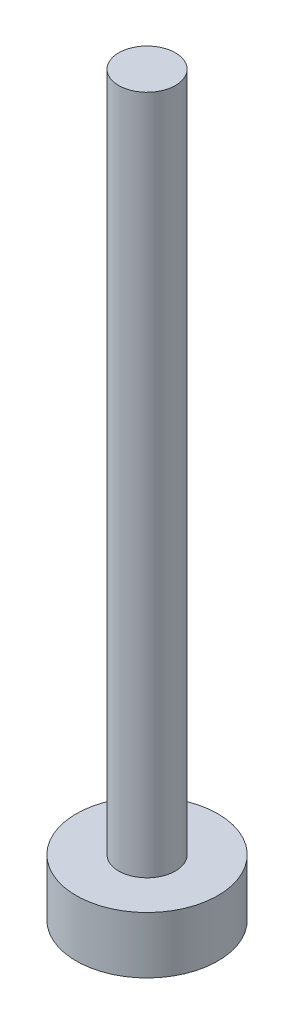
ISO-10303-21;
HEADER;
FILE_DESCRIPTION(('STEP AP214'),'2;1');
FILE_NAME('part.step','',(''),(''),'','','');
FILE_SCHEMA(('AUTOMOTIVE_DESIGN { 1 0 10303 214 1 1 1 1 }'));
ENDSEC;
DATA;
#1=APPLICATION_CONTEXT('core data for automotive mechanical design processes');
#2=APPLICATION_PROTOCOL_DEFINITION('international standard','automotive_design',2000,#1);
#3=PRODUCT_CONTEXT('',#1,'mechanical');
#4=PRODUCT('Part','Part','',(#3));
#5=PRODUCT_RELATED_PRODUCT_CATEGORY('part','',(#4));
#6=PRODUCT_DEFINITION_FORMATION('','',#4);
#7=PRODUCT_DEFINITION_CONTEXT('part definition',#1,'design');
#8=PRODUCT_DEFINITION('design','',#6,#7);
#9=PRODUCT_DEFINITION_SHAPE('','',#8);
#10=(LENGTH_UNIT() NAMED_UNIT(*) SI_UNIT(.MILLI.,.METRE.));
#11=(NAMED_UNIT(*) PLANE_ANGLE_UNIT() SI_UNIT($,.RADIAN.));
#12=(NAMED_UNIT(*) SI_UNIT($,.STERADIAN.) SOLID_ANGLE_UNIT());
#13=UNCERTAINTY_MEASURE_WITH_UNIT(LENGTH_MEASURE(1.E-05),#10,'distance_accuracy_value','');
#14=(GEOMETRIC_REPRESENTATION_CONTEXT(3) GLOBAL_UNCERTAINTY_ASSIGNED_CONTEXT((#13)) GLOBAL_UNIT_ASSIGNED_CONTEXT((#10,
#11,#12)) REPRESENTATION_CONTEXT('',''));
#15=CARTESIAN_POINT('',(0.,0.,0.));
#16=DIRECTION('',(0.,0.,1.));
#17=DIRECTION('',(1.,0.,0.));
#18=AXIS2_PLACEMENT_3D('',#15,#16,#17);
#19=CARTESIAN_POINT('',(0.,24.,0.));
#20=DIRECTION('',(0.,-1.,0.));
#21=DIRECTION('',(0.,0.,-1.));
#22=AXIS2_PLACEMENT_3D('',#19,#20,#21);
#23=CYLINDRICAL_SURFACE('',#22,1.);
#24=CARTESIAN_POINT('',(0.,24.,0.));
#25=DIRECTION('',(0.,1.,0.));
#26=DIRECTION('',(0.,0.,1.));
#27=AXIS2_PLACEMENT_3D('',#24,#25,#26);
#28=CIRCLE('',#27,1.);
#29=CARTESIAN_POINT('',(0.,24.,1.));
#30=VERTEX_POINT('',#29);
#31=EDGE_CURVE('E238',#30,#30,#28,.T.);
#32=ORIENTED_EDGE('',*,*,#31,.F.);
#33=EDGE_LOOP('',(#32));
#34=FACE_BOUND('',#33,.T.);
#35=CARTESIAN_POINT('',(0.,0.,0.));
#36=DIRECTION('',(0.,1.,0.));
#37=DIRECTION('',(0.,0.,1.));
#38=AXIS2_PLACEMENT_3D('',#35,#36,#37);
#39=CIRCLE('',#38,1.);
#40=CARTESIAN_POINT('',(0.,0.,1.));
#41=VERTEX_POINT('',#40);
#42=EDGE_CURVE('E235',#41,#41,#39,.T.);
#43=ORIENTED_EDGE('',*,*,#42,.T.);
#44=EDGE_LOOP('',(#43));
#45=FACE_BOUND('',#44,.T.);
#46=ADVANCED_FACE('F37',(#34,#45),#23,.T.);
#47=CARTESIAN_POINT('',(0.,24.,0.));
#48=DIRECTION('',(0.,1.,0.));
#49=DIRECTION('',(0.,0.,1.));
#50=AXIS2_PLACEMENT_3D('',#47,#48,#49);
#51=PLANE('',#50);
#52=ORIENTED_EDGE('',*,*,#31,.T.);
#53=EDGE_LOOP('',(#52));
#54=FACE_BOUND('',#53,.T.);
#55=ADVANCED_FACE('F422',(#54),#51,.T.);
#56=CARTESIAN_POINT('',(0.,-2.,0.));
#57=DIRECTION('',(0.,1.,0.));
#58=DIRECTION('',(0.,0.,1.));
#59=AXIS2_PLACEMENT_3D('',#56,#57,#58);
#60=CYLINDRICAL_SURFACE('',#59,2.5);
#61=CARTESIAN_POINT('',(0.,-2.,0.));
#62=DIRECTION('',(0.,-1.,0.));
#63=DIRECTION('',(0.,0.,-1.));
#64=AXIS2_PLACEMENT_3D('',#61,#62,#63);
#65=CIRCLE('',#64,2.5);
#66=CARTESIAN_POINT('',(0.,-2.,-2.5));
#67=VERTEX_POINT('',#66);
#68=EDGE_CURVE('E232',#67,#67,#65,.T.);
#69=ORIENTED_EDGE('',*,*,#68,.F.);
#70=EDGE_LOOP('',(#69));
#71=FACE_BOUND('',#70,.T.);
#72=CARTESIAN_POINT('',(0.,0.,0.));
#73=DIRECTION('',(0.,-1.,0.));
#74=DIRECTION('',(0.,0.,-1.));
#75=AXIS2_PLACEMENT_3D('',#72,#73,#74);
#76=CIRCLE('',#75,2.5);
#77=CARTESIAN_POINT('',(0.,0.,-2.5));
#78=VERTEX_POINT('',#77);
#79=EDGE_CURVE('E213',#78,#78,#76,.T.);
#80=ORIENTED_EDGE('',*,*,#79,.T.);
#81=EDGE_LOOP('',(#80));
#82=FACE_BOUND('',#81,.T.);
#83=ADVANCED_FACE('F428',(#71,#82),#60,.T.);
#84=CARTESIAN_POINT('',(0.,-2.,0.));
#85=DIRECTION('',(0.,-1.,0.));
#86=DIRECTION('',(0.,0.,-1.));
#87=AXIS2_PLACEMENT_3D('',#84,#85,#86);
#88=PLANE('',#87);
#89=DIRECTION('',(1.,0.,0.));
#90=VECTOR('',#89,1.);
#91=CARTESIAN_POINT('',(0.,-2.,-0.499999999999999));
#92=LINE('',#91,#90);
#93=CARTESIAN_POINT('',(0.5,-2.,-0.499999999999999));
#94=VERTEX_POINT('',#93);
#95=CARTESIAN_POINT('',(2.15,-2.,-0.499999999999999));
#96=VERTEX_POINT('',#95);
#97=EDGE_CURVE('E177',#94,#96,#92,.T.);
#98=ORIENTED_EDGE('',*,*,#97,.F.);
#99=DIRECTION('',(0.,0.,1.));
#100=VECTOR('',#99,1.);
#101=CARTESIAN_POINT('',(0.5,-2.,0.));
#102=LINE('',#101,#100);
#103=CARTESIAN_POINT('',(0.5,-2.,-2.15));
#104=VERTEX_POINT('',#103);
#105=EDGE_CURVE('E208',#104,#94,#102,.T.);
#106=ORIENTED_EDGE('',*,*,#105,.F.);
#107=DIRECTION('',(1.,0.,0.));
#108=VECTOR('',#107,1.);
#109=CARTESIAN_POINT('',(0.,-2.,-2.15));
#110=LINE('',#109,#108);
#111=CARTESIAN_POINT('',(-0.5,-2.,-2.15));
#112=VERTEX_POINT('',#111);
#113=EDGE_CURVE('E205',#112,#104,#110,.T.);
#114=ORIENTED_EDGE('',*,*,#113,.F.);
#115=DIRECTION('',(0.,0.,1.));
#116=VECTOR('',#115,1.);
#117=CARTESIAN_POINT('',(-0.5,-2.,0.));
#118=LINE('',#117,#116);
#119=CARTESIAN_POINT('',(-0.5,-2.,-0.499999999999999));
#120=VERTEX_POINT('',#119);
#121=EDGE_CURVE('E202',#112,#120,#118,.T.);
#122=ORIENTED_EDGE('',*,*,#121,.T.);
#123=DIRECTION('',(1.,0.,0.));
#124=VECTOR('',#123,1.);
#125=CARTESIAN_POINT('',(0.,-2.,-0.499999999999999));
#126=LINE('',#125,#124);
#127=CARTESIAN_POINT('',(-2.15,-2.,-0.499999999999999));
#128=VERTEX_POINT('',#127);
#129=EDGE_CURVE('E199',#128,#120,#126,.T.);
#130=ORIENTED_EDGE('',*,*,#129,.F.);
#131=DIRECTION('',(0.,0.,1.));
#132=VECTOR('',#131,1.);
#133=CARTESIAN_POINT('',(-2.15,-2.,0.));
#134=LINE('',#133,#132);
#135=CARTESIAN_POINT('',(-2.15,-2.,0.500000000000001));
#136=VERTEX_POINT('',#135);
#137=EDGE_CURVE('E196',#128,#136,#134,.T.);
#138=ORIENTED_EDGE('',*,*,#137,.T.);
#139=DIRECTION('',(1.,0.,0.));
#140=VECTOR('',#139,1.);
#141=CARTESIAN_POINT('',(0.,-2.,0.500000000000001));
#142=LINE('',#141,#140);
#143=CARTESIAN_POINT('',(-0.5,-2.,0.500000000000001));
#144=VERTEX_POINT('',#143);
#145=EDGE_CURVE('E193',#136,#144,#142,.T.);
#146=ORIENTED_EDGE('',*,*,#145,.T.);
#147=DIRECTION('',(0.,0.,1.));
#148=VECTOR('',#147,1.);
#149=CARTESIAN_POINT('',(-0.5,-2.,0.));
#150=LINE('',#149,#148);
#151=CARTESIAN_POINT('',(-0.5,-2.,2.15));
#152=VERTEX_POINT('',#151);
#153=EDGE_CURVE('E190',#144,#152,#150,.T.);
#154=ORIENTED_EDGE('',*,*,#153,.T.);
#155=DIRECTION('',(1.,0.,0.));
#156=VECTOR('',#155,1.);
#157=CARTESIAN_POINT('',(0.,-2.,2.15));
#158=LINE('',#157,#156);
#159=CARTESIAN_POINT('',(0.5,-2.,2.15));
#160=VERTEX_POINT('',#159);
#161=EDGE_CURVE('E185',#152,#160,#158,.T.);
#162=ORIENTED_EDGE('',*,*,#161,.T.);
#163=DIRECTION('',(0.,0.,1.));
#164=VECTOR('',#163,1.);
#165=CARTESIAN_POINT('',(0.5,-2.,0.));
#166=LINE('',#165,#164);
#167=CARTESIAN_POINT('',(0.5,-2.,0.500000000000001));
#168=VERTEX_POINT('',#167);
#169=EDGE_CURVE('E183',#168,#160,#166,.T.);
#170=ORIENTED_EDGE('',*,*,#169,.F.);
#171=DIRECTION('',(1.,0.,0.));
#172=VECTOR('',#171,1.);
#173=CARTESIAN_POINT('',(0.,-2.,0.500000000000001));
#174=LINE('',#173,#172);
#175=CARTESIAN_POINT('',(2.15,-2.,0.500000000000001));
#176=VERTEX_POINT('',#175);
#177=EDGE_CURVE('E165',#168,#176,#174,.T.);
#178=ORIENTED_EDGE('',*,*,#177,.T.);
#179=DIRECTION('',(0.,0.,1.));
#180=VECTOR('',#179,1.);
#181=CARTESIAN_POINT('',(2.15,-2.,0.));
#182=LINE('',#181,#180);
#183=EDGE_CURVE('E172',#96,#176,#182,.T.);
#184=ORIENTED_EDGE('',*,*,#183,.F.);
#185=EDGE_LOOP('',(#98,#106,#114,#122,#130,#138,#146,#154,#162,#170,#178,#184));
#186=FACE_BOUND('',#185,.T.);
#187=ORIENTED_EDGE('',*,*,#68,.T.);
#188=EDGE_LOOP('',(#187));
#189=FACE_BOUND('',#188,.T.);
#190=ADVANCED_FACE('F179',(#186,#189),#88,.T.);
#191=CARTESIAN_POINT('',(0.,0.,0.));
#192=DIRECTION('',(0.,-1.,0.));
#193=DIRECTION('',(0.,0.,-1.));
#194=AXIS2_PLACEMENT_3D('',#191,#192,#193);
#195=PLANE('',#194);
#196=ORIENTED_EDGE('',*,*,#42,.F.);
#197=EDGE_LOOP('',(#196));
#198=FACE_BOUND('',#197,.T.);
#199=ORIENTED_EDGE('',*,*,#79,.F.);
#200=EDGE_LOOP('',(#199));
#201=FACE_BOUND('',#200,.T.);
#202=ADVANCED_FACE('F661',(#198,#201),#195,.F.);
#203=CARTESIAN_POINT('',(0.,-1.5,-0.499999999999999));
#204=DIRECTION('',(0.,0.,-1.));
#205=DIRECTION('',(-1.,0.,0.));
#206=AXIS2_PLACEMENT_3D('',#203,#204,#205);
#207=PLANE('',#206);
#208=DIRECTION('',(0.,-1.,0.));
#209=VECTOR('',#208,1.);
#210=CARTESIAN_POINT('',(2.15,-1.5,-0.499999999999999));
#211=LINE('',#210,#209);
#212=CARTESIAN_POINT('',(2.15,-1.7,-0.499999999999999));
#213=VERTEX_POINT('',#212);
#214=EDGE_CURVE('E169',#213,#96,#211,.T.);
#215=ORIENTED_EDGE('',*,*,#214,.F.);
#216=DIRECTION('',(1.,0.,0.));
#217=VECTOR('',#216,1.);
#218=CARTESIAN_POINT('',(0.,-1.7,-0.499999999999999));
#219=LINE('',#218,#217);
#220=CARTESIAN_POINT('',(0.5,-1.7,-0.499999999999999));
#221=VERTEX_POINT('',#220);
#222=EDGE_CURVE('E11',#213,#221,#219,.F.);
#223=ORIENTED_EDGE('',*,*,#222,.T.);
#224=DIRECTION('',(0.,-1.,0.));
#225=VECTOR('',#224,1.);
#226=CARTESIAN_POINT('',(0.5,-1.5,-0.499999999999999));
#227=LINE('',#226,#225);
#228=EDGE_CURVE('E211',#221,#94,#227,.T.);
#229=ORIENTED_EDGE('',*,*,#228,.T.);
#230=ORIENTED_EDGE('',*,*,#97,.T.);
#231=EDGE_LOOP('',(#215,#223,#229,#230));
#232=FACE_BOUND('',#231,.T.);
#233=ADVANCED_FACE('F328',(#232),#207,.F.);
#234=CARTESIAN_POINT('',(0.5,-1.5,0.));
#235=DIRECTION('',(1.,0.,0.));
#236=DIRECTION('',(0.,0.,-1.));
#237=AXIS2_PLACEMENT_3D('',#234,#235,#236);
#238=PLANE('',#237);
#239=ORIENTED_EDGE('',*,*,#228,.F.);
#240=DIRECTION('',(0.,0.,1.));
#241=VECTOR('',#240,1.);
#242=CARTESIAN_POINT('',(0.5,-1.7,0.));
#243=LINE('',#242,#241);
#244=CARTESIAN_POINT('',(0.5,-1.7,-2.15));
#245=VERTEX_POINT('',#244);
#246=EDGE_CURVE('E268',#221,#245,#243,.F.);
#247=ORIENTED_EDGE('',*,*,#246,.T.);
#248=DIRECTION('',(0.,-1.,0.));
#249=VECTOR('',#248,1.);
#250=CARTESIAN_POINT('',(0.5,-1.5,-2.15));
#251=LINE('',#250,#249);
#252=EDGE_CURVE('E214',#245,#104,#251,.T.);
#253=ORIENTED_EDGE('',*,*,#252,.T.);
#254=ORIENTED_EDGE('',*,*,#105,.T.);
#255=EDGE_LOOP('',(#239,#247,#253,#254));
#256=FACE_BOUND('',#255,.T.);
#257=ADVANCED_FACE('F334',(#256),#238,.F.);
#258=CARTESIAN_POINT('',(0.,-1.5,-2.15));
#259=DIRECTION('',(0.,0.,-1.));
#260=DIRECTION('',(-1.,0.,0.));
#261=AXIS2_PLACEMENT_3D('',#258,#259,#260);
#262=PLANE('',#261);
#263=ORIENTED_EDGE('',*,*,#252,.F.);
#264=DIRECTION('',(1.,0.,0.));
#265=VECTOR('',#264,1.);
#266=CARTESIAN_POINT('',(0.,-1.7,-2.15));
#267=LINE('',#266,#265);
#268=CARTESIAN_POINT('',(-0.5,-1.7,-2.15));
#269=VERTEX_POINT('',#268);
#270=EDGE_CURVE('E271',#245,#269,#267,.F.);
#271=ORIENTED_EDGE('',*,*,#270,.T.);
#272=DIRECTION('',(0.,-1.,0.));
#273=VECTOR('',#272,1.);
#274=CARTESIAN_POINT('',(-0.5,-1.5,-2.15));
#275=LINE('',#274,#273);
#276=EDGE_CURVE('E216',#269,#112,#275,.T.);
#277=ORIENTED_EDGE('',*,*,#276,.T.);
#278=ORIENTED_EDGE('',*,*,#113,.T.);
#279=EDGE_LOOP('',(#263,#271,#277,#278));
#280=FACE_BOUND('',#279,.T.);
#281=ADVANCED_FACE('F338',(#280),#262,.F.);
#282=CARTESIAN_POINT('',(-0.5,-1.5,0.));
#283=DIRECTION('',(1.,0.,0.));
#284=DIRECTION('',(0.,0.,-1.));
#285=AXIS2_PLACEMENT_3D('',#282,#283,#284);
#286=PLANE('',#285);
#287=ORIENTED_EDGE('',*,*,#276,.F.);
#288=DIRECTION('',(0.,0.,1.));
#289=VECTOR('',#288,1.);
#290=CARTESIAN_POINT('',(-0.5,-1.7,-0.499999999999999));
#291=LINE('',#290,#289);
#292=CARTESIAN_POINT('',(-0.5,-1.7,-0.499999999999999));
#293=VERTEX_POINT('',#292);
#294=EDGE_CURVE('E273',#269,#293,#291,.T.);
#295=ORIENTED_EDGE('',*,*,#294,.T.);
#296=DIRECTION('',(0.,-1.,0.));
#297=VECTOR('',#296,1.);
#298=CARTESIAN_POINT('',(-0.5,-1.5,-0.499999999999999));
#299=LINE('',#298,#297);
#300=EDGE_CURVE('E218',#293,#120,#299,.T.);
#301=ORIENTED_EDGE('',*,*,#300,.T.);
#302=ORIENTED_EDGE('',*,*,#121,.F.);
#303=EDGE_LOOP('',(#287,#295,#301,#302));
#304=FACE_BOUND('',#303,.T.);
#305=ADVANCED_FACE('F344',(#304),#286,.T.);
#306=CARTESIAN_POINT('',(0.,-1.5,-0.499999999999999));
#307=DIRECTION('',(0.,0.,-1.));
#308=DIRECTION('',(-1.,0.,0.));
#309=AXIS2_PLACEMENT_3D('',#306,#307,#308);
#310=PLANE('',#309);
#311=ORIENTED_EDGE('',*,*,#300,.F.);
#312=DIRECTION('',(1.,0.,0.));
#313=VECTOR('',#312,1.);
#314=CARTESIAN_POINT('',(0.,-1.7,-0.499999999999999));
#315=LINE('',#314,#313);
#316=CARTESIAN_POINT('',(-2.15,-1.7,-0.499999999999999));
#317=VERTEX_POINT('',#316);
#318=EDGE_CURVE('E275',#293,#317,#315,.F.);
#319=ORIENTED_EDGE('',*,*,#318,.T.);
#320=DIRECTION('',(0.,-1.,0.));
#321=VECTOR('',#320,1.);
#322=CARTESIAN_POINT('',(-2.15,-1.5,-0.499999999999999));
#323=LINE('',#322,#321);
#324=EDGE_CURVE('E220',#317,#128,#323,.T.);
#325=ORIENTED_EDGE('',*,*,#324,.T.);
#326=ORIENTED_EDGE('',*,*,#129,.T.);
#327=EDGE_LOOP('',(#311,#319,#325,#326));
#328=FACE_BOUND('',#327,.T.);
#329=ADVANCED_FACE('F349',(#328),#310,.F.);
#330=CARTESIAN_POINT('',(-2.15,-1.5,0.));
#331=DIRECTION('',(1.,0.,0.));
#332=DIRECTION('',(0.,0.,-1.));
#333=AXIS2_PLACEMENT_3D('',#330,#331,#332);
#334=PLANE('',#333);
#335=ORIENTED_EDGE('',*,*,#324,.F.);
#336=DIRECTION('',(0.,0.,1.));
#337=VECTOR('',#336,1.);
#338=CARTESIAN_POINT('',(-2.15,-1.7,0.500000000000001));
#339=LINE('',#338,#337);
#340=CARTESIAN_POINT('',(-2.15,-1.7,0.500000000000001));
#341=VERTEX_POINT('',#340);
#342=EDGE_CURVE('E277',#317,#341,#339,.T.);
#343=ORIENTED_EDGE('',*,*,#342,.T.);
#344=DIRECTION('',(0.,-1.,0.));
#345=VECTOR('',#344,1.);
#346=CARTESIAN_POINT('',(-2.15,-1.5,0.500000000000001));
#347=LINE('',#346,#345);
#348=EDGE_CURVE('E222',#341,#136,#347,.T.);
#349=ORIENTED_EDGE('',*,*,#348,.T.);
#350=ORIENTED_EDGE('',*,*,#137,.F.);
#351=EDGE_LOOP('',(#335,#343,#349,#350));
#352=FACE_BOUND('',#351,.T.);
#353=ADVANCED_FACE('F354',(#352),#334,.T.);
#354=CARTESIAN_POINT('',(0.,-1.5,0.500000000000001));
#355=DIRECTION('',(0.,0.,-1.));
#356=DIRECTION('',(-1.,0.,0.));
#357=AXIS2_PLACEMENT_3D('',#354,#355,#356);
#358=PLANE('',#357);
#359=ORIENTED_EDGE('',*,*,#348,.F.);
#360=DIRECTION('',(1.,0.,0.));
#361=VECTOR('',#360,1.);
#362=CARTESIAN_POINT('',(-0.5,-1.7,0.500000000000001));
#363=LINE('',#362,#361);
#364=CARTESIAN_POINT('',(-0.5,-1.7,0.500000000000001));
#365=VERTEX_POINT('',#364);
#366=EDGE_CURVE('E279',#341,#365,#363,.T.);
#367=ORIENTED_EDGE('',*,*,#366,.T.);
#368=DIRECTION('',(0.,-1.,0.));
#369=VECTOR('',#368,1.);
#370=CARTESIAN_POINT('',(-0.5,-1.5,0.500000000000001));
#371=LINE('',#370,#369);
#372=EDGE_CURVE('E224',#365,#144,#371,.T.);
#373=ORIENTED_EDGE('',*,*,#372,.T.);
#374=ORIENTED_EDGE('',*,*,#145,.F.);
#375=EDGE_LOOP('',(#359,#367,#373,#374));
#376=FACE_BOUND('',#375,.T.);
#377=ADVANCED_FACE('F358',(#376),#358,.T.);
#378=CARTESIAN_POINT('',(-0.5,-1.5,0.));
#379=DIRECTION('',(1.,0.,0.));
#380=DIRECTION('',(0.,0.,-1.));
#381=AXIS2_PLACEMENT_3D('',#378,#379,#380);
#382=PLANE('',#381);
#383=ORIENTED_EDGE('',*,*,#372,.F.);
#384=DIRECTION('',(0.,0.,1.));
#385=VECTOR('',#384,1.);
#386=CARTESIAN_POINT('',(-0.5,-1.7,2.15));
#387=LINE('',#386,#385);
#388=CARTESIAN_POINT('',(-0.5,-1.7,2.15));
#389=VERTEX_POINT('',#388);
#390=EDGE_CURVE('E281',#365,#389,#387,.T.);
#391=ORIENTED_EDGE('',*,*,#390,.T.);
#392=DIRECTION('',(0.,-1.,0.));
#393=VECTOR('',#392,1.);
#394=CARTESIAN_POINT('',(-0.5,-1.5,2.15));
#395=LINE('',#394,#393);
#396=EDGE_CURVE('E226',#389,#152,#395,.T.);
#397=ORIENTED_EDGE('',*,*,#396,.T.);
#398=ORIENTED_EDGE('',*,*,#153,.F.);
#399=EDGE_LOOP('',(#383,#391,#397,#398));
#400=FACE_BOUND('',#399,.T.);
#401=ADVANCED_FACE('F363',(#400),#382,.T.);
#402=CARTESIAN_POINT('',(0.,-1.5,2.15));
#403=DIRECTION('',(0.,0.,-1.));
#404=DIRECTION('',(-1.,0.,0.));
#405=AXIS2_PLACEMENT_3D('',#402,#403,#404);
#406=PLANE('',#405);
#407=ORIENTED_EDGE('',*,*,#396,.F.);
#408=DIRECTION('',(1.,0.,0.));
#409=VECTOR('',#408,1.);
#410=CARTESIAN_POINT('',(0.5,-1.7,2.15));
#411=LINE('',#410,#409);
#412=CARTESIAN_POINT('',(0.5,-1.7,2.15));
#413=VERTEX_POINT('',#412);
#414=EDGE_CURVE('E283',#389,#413,#411,.T.);
#415=ORIENTED_EDGE('',*,*,#414,.T.);
#416=DIRECTION('',(0.,-1.,0.));
#417=VECTOR('',#416,1.);
#418=CARTESIAN_POINT('',(0.5,-1.5,2.15));
#419=LINE('',#418,#417);
#420=EDGE_CURVE('E228',#413,#160,#419,.T.);
#421=ORIENTED_EDGE('',*,*,#420,.T.);
#422=ORIENTED_EDGE('',*,*,#161,.F.);
#423=EDGE_LOOP('',(#407,#415,#421,#422));
#424=FACE_BOUND('',#423,.T.);
#425=ADVANCED_FACE('F367',(#424),#406,.T.);
#426=CARTESIAN_POINT('',(0.5,-1.5,0.));
#427=DIRECTION('',(1.,0.,0.));
#428=DIRECTION('',(0.,0.,-1.));
#429=AXIS2_PLACEMENT_3D('',#426,#427,#428);
#430=PLANE('',#429);
#431=ORIENTED_EDGE('',*,*,#420,.F.);
#432=DIRECTION('',(0.,0.,1.));
#433=VECTOR('',#432,1.);
#434=CARTESIAN_POINT('',(0.5,-1.7,0.));
#435=LINE('',#434,#433);
#436=CARTESIAN_POINT('',(0.5,-1.7,0.500000000000001));
#437=VERTEX_POINT('',#436);
#438=EDGE_CURVE('E285',#413,#437,#435,.F.);
#439=ORIENTED_EDGE('',*,*,#438,.T.);
#440=DIRECTION('',(0.,-1.,0.));
#441=VECTOR('',#440,1.);
#442=CARTESIAN_POINT('',(0.5,-1.5,0.500000000000001));
#443=LINE('',#442,#441);
#444=EDGE_CURVE('E168',#437,#168,#443,.T.);
#445=ORIENTED_EDGE('',*,*,#444,.T.);
#446=ORIENTED_EDGE('',*,*,#169,.T.);
#447=EDGE_LOOP('',(#431,#439,#445,#446));
#448=FACE_BOUND('',#447,.T.);
#449=ADVANCED_FACE('F371',(#448),#430,.F.);
#450=CARTESIAN_POINT('',(0.,-1.5,0.500000000000001));
#451=DIRECTION('',(0.,0.,-1.));
#452=DIRECTION('',(-1.,0.,0.));
#453=AXIS2_PLACEMENT_3D('',#450,#451,#452);
#454=PLANE('',#453);
#455=ORIENTED_EDGE('',*,*,#444,.F.);
#456=DIRECTION('',(1.,0.,0.));
#457=VECTOR('',#456,1.);
#458=CARTESIAN_POINT('',(2.15,-1.7,0.500000000000001));
#459=LINE('',#458,#457);
#460=CARTESIAN_POINT('',(2.15,-1.7,0.500000000000001));
#461=VERTEX_POINT('',#460);
#462=EDGE_CURVE('E61',#437,#461,#459,.T.);
#463=ORIENTED_EDGE('',*,*,#462,.T.);
#464=DIRECTION('',(0.,-1.,0.));
#465=VECTOR('',#464,1.);
#466=CARTESIAN_POINT('',(2.15,-1.5,0.500000000000001));
#467=LINE('',#466,#465);
#468=EDGE_CURVE('E161',#461,#176,#467,.T.);
#469=ORIENTED_EDGE('',*,*,#468,.T.);
#470=ORIENTED_EDGE('',*,*,#177,.F.);
#471=EDGE_LOOP('',(#455,#463,#469,#470));
#472=FACE_BOUND('',#471,.T.);
#473=ADVANCED_FACE('F163',(#472),#454,.T.);
#474=CARTESIAN_POINT('',(2.15,-1.5,0.));
#475=DIRECTION('',(1.,0.,0.));
#476=DIRECTION('',(0.,0.,-1.));
#477=AXIS2_PLACEMENT_3D('',#474,#475,#476);
#478=PLANE('',#477);
#479=ORIENTED_EDGE('',*,*,#468,.F.);
#480=DIRECTION('',(0.,0.,1.));
#481=VECTOR('',#480,1.);
#482=CARTESIAN_POINT('',(2.15,-1.7,0.));
#483=LINE('',#482,#481);
#484=EDGE_CURVE('E46',#461,#213,#483,.F.);
#485=ORIENTED_EDGE('',*,*,#484,.T.);
#486=ORIENTED_EDGE('',*,*,#214,.T.);
#487=ORIENTED_EDGE('',*,*,#183,.T.);
#488=EDGE_LOOP('',(#479,#485,#486,#487));
#489=FACE_BOUND('',#488,.T.);
#490=ADVANCED_FACE('F173',(#489),#478,.F.);
#491=CARTESIAN_POINT('',(0.,-1.5,0.));
#492=DIRECTION('',(0.,-1.,0.));
#493=DIRECTION('',(0.,0.,-1.));
#494=AXIS2_PLACEMENT_3D('',#491,#492,#493);
#495=PLANE('',#494);
#496=DIRECTION('',(1.,0.,0.));
#497=VECTOR('',#496,1.);
#498=CARTESIAN_POINT('',(0.,-1.5,-1.95));
#499=LINE('',#498,#497);
#500=CARTESIAN_POINT('',(-0.3,-1.5,-1.95));
#501=VERTEX_POINT('',#500);
#502=CARTESIAN_POINT('',(0.3,-1.5,-1.95));
#503=VERTEX_POINT('',#502);
#504=EDGE_CURVE('E263',#501,#503,#499,.T.);
#505=ORIENTED_EDGE('',*,*,#504,.T.);
#506=DIRECTION('',(0.,0.,1.));
#507=VECTOR('',#506,1.);
#508=CARTESIAN_POINT('',(0.3,-1.5,0.));
#509=LINE('',#508,#507);
#510=CARTESIAN_POINT('',(0.3,-1.5,-0.299999999999999));
#511=VERTEX_POINT('',#510);
#512=EDGE_CURVE('E265',#503,#511,#509,.T.);
#513=ORIENTED_EDGE('',*,*,#512,.T.);
#514=DIRECTION('',(1.,0.,0.));
#515=VECTOR('',#514,1.);
#516=CARTESIAN_POINT('',(0.,-1.5,-0.299999999999999));
#517=LINE('',#516,#515);
#518=CARTESIAN_POINT('',(1.95,-1.5,-0.299999999999999));
#519=VERTEX_POINT('',#518);
#520=EDGE_CURVE('E241',#511,#519,#517,.T.);
#521=ORIENTED_EDGE('',*,*,#520,.T.);
#522=DIRECTION('',(0.,0.,1.));
#523=VECTOR('',#522,1.);
#524=CARTESIAN_POINT('',(1.95,-1.5,0.));
#525=LINE('',#524,#523);
#526=CARTESIAN_POINT('',(1.95,-1.5,0.300000000000001));
#527=VERTEX_POINT('',#526);
#528=EDGE_CURVE('E245',#519,#527,#525,.T.);
#529=ORIENTED_EDGE('',*,*,#528,.T.);
#530=DIRECTION('',(1.,0.,0.));
#531=VECTOR('',#530,1.);
#532=CARTESIAN_POINT('',(0.5,-1.5,0.300000000000001));
#533=LINE('',#532,#531);
#534=CARTESIAN_POINT('',(0.3,-1.5,0.300000000000001));
#535=VERTEX_POINT('',#534);
#536=EDGE_CURVE('E247',#527,#535,#533,.F.);
#537=ORIENTED_EDGE('',*,*,#536,.T.);
#538=DIRECTION('',(0.,0.,1.));
#539=VECTOR('',#538,1.);
#540=CARTESIAN_POINT('',(0.3,-1.5,0.));
#541=LINE('',#540,#539);
#542=CARTESIAN_POINT('',(0.3,-1.5,1.95));
#543=VERTEX_POINT('',#542);
#544=EDGE_CURVE('E249',#535,#543,#541,.T.);
#545=ORIENTED_EDGE('',*,*,#544,.T.);
#546=DIRECTION('',(1.,0.,0.));
#547=VECTOR('',#546,1.);
#548=CARTESIAN_POINT('',(-0.5,-1.5,1.95));
#549=LINE('',#548,#547);
#550=CARTESIAN_POINT('',(-0.3,-1.5,1.95));
#551=VERTEX_POINT('',#550);
#552=EDGE_CURVE('E251',#543,#551,#549,.F.);
#553=ORIENTED_EDGE('',*,*,#552,.T.);
#554=DIRECTION('',(0.,0.,1.));
#555=VECTOR('',#554,1.);
#556=CARTESIAN_POINT('',(-0.3,-1.5,0.500000000000001));
#557=LINE('',#556,#555);
#558=CARTESIAN_POINT('',(-0.3,-1.5,0.300000000000001));
#559=VERTEX_POINT('',#558);
#560=EDGE_CURVE('E253',#551,#559,#557,.F.);
#561=ORIENTED_EDGE('',*,*,#560,.T.);
#562=DIRECTION('',(1.,0.,0.));
#563=VECTOR('',#562,1.);
#564=CARTESIAN_POINT('',(-2.15,-1.5,0.300000000000001));
#565=LINE('',#564,#563);
#566=CARTESIAN_POINT('',(-1.95,-1.5,0.300000000000001));
#567=VERTEX_POINT('',#566);
#568=EDGE_CURVE('E255',#559,#567,#565,.F.);
#569=ORIENTED_EDGE('',*,*,#568,.T.);
#570=DIRECTION('',(0.,0.,1.));
#571=VECTOR('',#570,1.);
#572=CARTESIAN_POINT('',(-1.95,-1.5,-0.499999999999999));
#573=LINE('',#572,#571);
#574=CARTESIAN_POINT('',(-1.95,-1.5,-0.299999999999999));
#575=VERTEX_POINT('',#574);
#576=EDGE_CURVE('E257',#567,#575,#573,.F.);
#577=ORIENTED_EDGE('',*,*,#576,.T.);
#578=DIRECTION('',(1.,0.,0.));
#579=VECTOR('',#578,1.);
#580=CARTESIAN_POINT('',(0.,-1.5,-0.299999999999999));
#581=LINE('',#580,#579);
#582=CARTESIAN_POINT('',(-0.3,-1.5,-0.299999999999999));
#583=VERTEX_POINT('',#582);
#584=EDGE_CURVE('E259',#575,#583,#581,.T.);
#585=ORIENTED_EDGE('',*,*,#584,.T.);
#586=DIRECTION('',(0.,0.,1.));
#587=VECTOR('',#586,1.);
#588=CARTESIAN_POINT('',(-0.3,-1.5,-2.15));
#589=LINE('',#588,#587);
#590=EDGE_CURVE('E261',#583,#501,#589,.F.);
#591=ORIENTED_EDGE('',*,*,#590,.T.);
#592=EDGE_LOOP('',(#505,#513,#521,#529,#537,#545,#553,#561,#569,#577,#585,#591));
#593=FACE_BOUND('',#592,.T.);
#594=ADVANCED_FACE('F410',(#593),#495,.T.);
#595=CARTESIAN_POINT('',(-0.3,-1.7,0.));
#596=DIRECTION('',(0.,0.,-1.));
#597=DIRECTION('',(-1.,0.,0.));
#598=AXIS2_PLACEMENT_3D('',#595,#596,#597);
#599=CYLINDRICAL_SURFACE('',#598,0.2);
#600=CARTESIAN_POINT('',(-0.3,-1.7,1.95));
#601=DIRECTION('',(-0.707106781186547,0.,-0.707106781186547));
#602=DIRECTION('',(0.707106781186547,0.,-0.707106781186547));
#603=AXIS2_PLACEMENT_3D('',#600,#601,#602);
#604=ELLIPSE('',#603,0.282842712474619,0.2);
#605=EDGE_CURVE('E316',#389,#551,#604,.T.);
#606=ORIENTED_EDGE('',*,*,#605,.F.);
#607=ORIENTED_EDGE('',*,*,#390,.F.);
#608=CARTESIAN_POINT('',(-0.3,-1.7,0.300000000000001));
#609=DIRECTION('',(-0.707106781186547,0.,-0.707106781186547));
#610=DIRECTION('',(0.707106781186547,0.,-0.707106781186547));
#611=AXIS2_PLACEMENT_3D('',#608,#609,#610);
#612=ELLIPSE('',#611,0.282842712474619,0.2);
#613=EDGE_CURVE('E41',#559,#365,#612,.F.);
#614=ORIENTED_EDGE('',*,*,#613,.F.);
#615=ORIENTED_EDGE('',*,*,#560,.F.);
#616=EDGE_LOOP('',(#606,#607,#614,#615));
#617=FACE_BOUND('',#616,.T.);
#618=ADVANCED_FACE('F39',(#617),#599,.F.);
#619=CARTESIAN_POINT('',(0.,-1.7,0.300000000000001));
#620=DIRECTION('',(-1.,0.,0.));
#621=DIRECTION('',(0.,0.,1.));
#622=AXIS2_PLACEMENT_3D('',#619,#620,#621);
#623=CYLINDRICAL_SURFACE('',#622,0.2);
#624=ORIENTED_EDGE('',*,*,#613,.T.);
#625=ORIENTED_EDGE('',*,*,#366,.F.);
#626=CARTESIAN_POINT('',(-1.95,-1.7,0.300000000000001));
#627=DIRECTION('',(-0.707106781186547,0.,-0.707106781186547));
#628=DIRECTION('',(0.707106781186547,0.,-0.707106781186547));
#629=AXIS2_PLACEMENT_3D('',#626,#627,#628);
#630=ELLIPSE('',#629,0.282842712474619,0.2);
#631=EDGE_CURVE('E314',#567,#341,#630,.F.);
#632=ORIENTED_EDGE('',*,*,#631,.F.);
#633=ORIENTED_EDGE('',*,*,#568,.F.);
#634=EDGE_LOOP('',(#624,#625,#632,#633));
#635=FACE_BOUND('',#634,.T.);
#636=ADVANCED_FACE('F408',(#635),#623,.F.);
#637=CARTESIAN_POINT('',(0.,-1.7,1.95));
#638=DIRECTION('',(-1.,0.,0.));
#639=DIRECTION('',(0.,0.,1.));
#640=AXIS2_PLACEMENT_3D('',#637,#638,#639);
#641=CYLINDRICAL_SURFACE('',#640,0.2);
#642=ORIENTED_EDGE('',*,*,#605,.T.);
#643=ORIENTED_EDGE('',*,*,#552,.F.);
#644=CARTESIAN_POINT('',(0.3,-1.7,1.95));
#645=DIRECTION('',(-0.707106781186547,0.,0.707106781186547));
#646=DIRECTION('',(-0.707106781186547,0.,-0.707106781186547));
#647=AXIS2_PLACEMENT_3D('',#644,#645,#646);
#648=ELLIPSE('',#647,0.282842712474619,0.2);
#649=EDGE_CURVE('E311',#413,#543,#648,.T.);
#650=ORIENTED_EDGE('',*,*,#649,.F.);
#651=ORIENTED_EDGE('',*,*,#414,.F.);
#652=EDGE_LOOP('',(#642,#643,#650,#651));
#653=FACE_BOUND('',#652,.T.);
#654=ADVANCED_FACE('F413',(#653),#641,.F.);
#655=CARTESIAN_POINT('',(-1.95,-1.7,0.));
#656=DIRECTION('',(0.,0.,-1.));
#657=DIRECTION('',(-1.,0.,0.));
#658=AXIS2_PLACEMENT_3D('',#655,#656,#657);
#659=CYLINDRICAL_SURFACE('',#658,0.2);
#660=ORIENTED_EDGE('',*,*,#631,.T.);
#661=ORIENTED_EDGE('',*,*,#342,.F.);
#662=CARTESIAN_POINT('',(-1.95,-1.7,-0.299999999999999));
#663=DIRECTION('',(0.707106781186547,0.,-0.707106781186547));
#664=DIRECTION('',(0.707106781186547,0.,0.707106781186547));
#665=AXIS2_PLACEMENT_3D('',#662,#663,#664);
#666=ELLIPSE('',#665,0.282842712474619,0.2);
#667=EDGE_CURVE('E308',#575,#317,#666,.F.);
#668=ORIENTED_EDGE('',*,*,#667,.F.);
#669=ORIENTED_EDGE('',*,*,#576,.F.);
#670=EDGE_LOOP('',(#660,#661,#668,#669));
#671=FACE_BOUND('',#670,.T.);
#672=ADVANCED_FACE('F406',(#671),#659,.F.);
#673=CARTESIAN_POINT('',(0.3,-1.7,0.));
#674=DIRECTION('',(0.,0.,1.));
#675=DIRECTION('',(1.,0.,0.));
#676=AXIS2_PLACEMENT_3D('',#673,#674,#675);
#677=CYLINDRICAL_SURFACE('',#676,0.2);
#678=ORIENTED_EDGE('',*,*,#649,.T.);
#679=ORIENTED_EDGE('',*,*,#544,.F.);
#680=CARTESIAN_POINT('',(0.3,-1.7,0.300000000000001));
#681=DIRECTION('',(-0.707106781186547,0.,0.707106781186547));
#682=DIRECTION('',(-0.707106781186547,0.,-0.707106781186547));
#683=AXIS2_PLACEMENT_3D('',#680,#681,#682);
#684=ELLIPSE('',#683,0.282842712474619,0.2);
#685=EDGE_CURVE('E305',#437,#535,#684,.T.);
#686=ORIENTED_EDGE('',*,*,#685,.F.);
#687=ORIENTED_EDGE('',*,*,#438,.F.);
#688=EDGE_LOOP('',(#678,#679,#686,#687));
#689=FACE_BOUND('',#688,.T.);
#690=ADVANCED_FACE('F376',(#689),#677,.F.);
#691=CARTESIAN_POINT('',(0.,-1.7,-0.299999999999999));
#692=DIRECTION('',(1.,0.,0.));
#693=DIRECTION('',(0.,0.,-1.));
#694=AXIS2_PLACEMENT_3D('',#691,#692,#693);
#695=CYLINDRICAL_SURFACE('',#694,0.2);
#696=ORIENTED_EDGE('',*,*,#667,.T.);
#697=ORIENTED_EDGE('',*,*,#318,.F.);
#698=CARTESIAN_POINT('',(-0.3,-1.7,-0.299999999999999));
#699=DIRECTION('',(0.707106781186547,0.,-0.707106781186547));
#700=DIRECTION('',(0.707106781186547,0.,0.707106781186547));
#701=AXIS2_PLACEMENT_3D('',#698,#699,#700);
#702=ELLIPSE('',#701,0.282842712474619,0.2);
#703=EDGE_CURVE('E302',#583,#293,#702,.F.);
#704=ORIENTED_EDGE('',*,*,#703,.F.);
#705=ORIENTED_EDGE('',*,*,#584,.F.);
#706=EDGE_LOOP('',(#696,#697,#704,#705));
#707=FACE_BOUND('',#706,.T.);
#708=ADVANCED_FACE('F402',(#707),#695,.F.);
#709=CARTESIAN_POINT('',(0.,-1.7,0.300000000000001));
#710=DIRECTION('',(-1.,0.,0.));
#711=DIRECTION('',(0.,0.,1.));
#712=AXIS2_PLACEMENT_3D('',#709,#710,#711);
#713=CYLINDRICAL_SURFACE('',#712,0.2);
#714=ORIENTED_EDGE('',*,*,#685,.T.);
#715=ORIENTED_EDGE('',*,*,#536,.F.);
#716=CARTESIAN_POINT('',(1.95,-1.7,0.300000000000001));
#717=DIRECTION('',(-0.707106781186547,0.,0.707106781186547));
#718=DIRECTION('',(-0.707106781186547,0.,-0.707106781186547));
#719=AXIS2_PLACEMENT_3D('',#716,#717,#718);
#720=ELLIPSE('',#719,0.282842712474619,0.2);
#721=EDGE_CURVE('E299',#461,#527,#720,.T.);
#722=ORIENTED_EDGE('',*,*,#721,.F.);
#723=ORIENTED_EDGE('',*,*,#462,.F.);
#724=EDGE_LOOP('',(#714,#715,#722,#723));
#725=FACE_BOUND('',#724,.T.);
#726=ADVANCED_FACE('F379',(#725),#713,.F.);
#727=CARTESIAN_POINT('',(-0.3,-1.7,0.));
#728=DIRECTION('',(0.,0.,-1.));
#729=DIRECTION('',(-1.,0.,0.));
#730=AXIS2_PLACEMENT_3D('',#727,#728,#729);
#731=CYLINDRICAL_SURFACE('',#730,0.2);
#732=ORIENTED_EDGE('',*,*,#703,.T.);
#733=ORIENTED_EDGE('',*,*,#294,.F.);
#734=CARTESIAN_POINT('',(-0.3,-1.7,-1.95));
#735=DIRECTION('',(0.707106781186547,0.,-0.707106781186547));
#736=DIRECTION('',(0.707106781186547,0.,0.707106781186547));
#737=AXIS2_PLACEMENT_3D('',#734,#735,#736);
#738=ELLIPSE('',#737,0.282842712474619,0.2);
#739=EDGE_CURVE('E296',#501,#269,#738,.F.);
#740=ORIENTED_EDGE('',*,*,#739,.F.);
#741=ORIENTED_EDGE('',*,*,#590,.F.);
#742=EDGE_LOOP('',(#732,#733,#740,#741));
#743=FACE_BOUND('',#742,.T.);
#744=ADVANCED_FACE('F398',(#743),#731,.F.);
#745=CARTESIAN_POINT('',(1.95,-1.7,0.));
#746=DIRECTION('',(0.,0.,1.));
#747=DIRECTION('',(1.,0.,0.));
#748=AXIS2_PLACEMENT_3D('',#745,#746,#747);
#749=CYLINDRICAL_SURFACE('',#748,0.2);
#750=ORIENTED_EDGE('',*,*,#721,.T.);
#751=ORIENTED_EDGE('',*,*,#528,.F.);
#752=CARTESIAN_POINT('',(1.95,-1.7,-0.299999999999999));
#753=DIRECTION('',(0.707106781186547,0.,0.707106781186547));
#754=DIRECTION('',(-0.707106781186547,0.,0.707106781186547));
#755=AXIS2_PLACEMENT_3D('',#752,#753,#754);
#756=ELLIPSE('',#755,0.282842712474619,0.2);
#757=EDGE_CURVE('E293',#213,#519,#756,.T.);
#758=ORIENTED_EDGE('',*,*,#757,.F.);
#759=ORIENTED_EDGE('',*,*,#484,.F.);
#760=EDGE_LOOP('',(#750,#751,#758,#759));
#761=FACE_BOUND('',#760,.T.);
#762=ADVANCED_FACE('F382',(#761),#749,.F.);
#763=CARTESIAN_POINT('',(0.,-1.7,-1.95));
#764=DIRECTION('',(1.,0.,0.));
#765=DIRECTION('',(0.,0.,-1.));
#766=AXIS2_PLACEMENT_3D('',#763,#764,#765);
#767=CYLINDRICAL_SURFACE('',#766,0.2);
#768=ORIENTED_EDGE('',*,*,#739,.T.);
#769=ORIENTED_EDGE('',*,*,#270,.F.);
#770=CARTESIAN_POINT('',(0.3,-1.7,-1.95));
#771=DIRECTION('',(0.707106781186547,0.,0.707106781186547));
#772=DIRECTION('',(-0.707106781186547,0.,0.707106781186547));
#773=AXIS2_PLACEMENT_3D('',#770,#771,#772);
#774=ELLIPSE('',#773,0.282842712474619,0.2);
#775=EDGE_CURVE('E291',#503,#245,#774,.F.);
#776=ORIENTED_EDGE('',*,*,#775,.F.);
#777=ORIENTED_EDGE('',*,*,#504,.F.);
#778=EDGE_LOOP('',(#768,#769,#776,#777));
#779=FACE_BOUND('',#778,.T.);
#780=ADVANCED_FACE('F394',(#779),#767,.F.);
#781=CARTESIAN_POINT('',(0.,-1.7,-0.299999999999999));
#782=DIRECTION('',(1.,0.,0.));
#783=DIRECTION('',(0.,0.,-1.));
#784=AXIS2_PLACEMENT_3D('',#781,#782,#783);
#785=CYLINDRICAL_SURFACE('',#784,0.2);
#786=ORIENTED_EDGE('',*,*,#757,.T.);
#787=ORIENTED_EDGE('',*,*,#520,.F.);
#788=CARTESIAN_POINT('',(0.3,-1.7,-0.299999999999999));
#789=DIRECTION('',(0.707106781186547,0.,0.707106781186547));
#790=DIRECTION('',(0.707106781186547,0.,-0.707106781186547));
#791=AXIS2_PLACEMENT_3D('',#788,#789,#790);
#792=ELLIPSE('',#791,0.282842712474619,0.2);
#793=EDGE_CURVE('E289',#221,#511,#792,.T.);
#794=ORIENTED_EDGE('',*,*,#793,.F.);
#795=ORIENTED_EDGE('',*,*,#222,.F.);
#796=EDGE_LOOP('',(#786,#787,#794,#795));
#797=FACE_BOUND('',#796,.T.);
#798=ADVANCED_FACE('F387',(#797),#785,.F.);
#799=CARTESIAN_POINT('',(0.3,-1.7,0.));
#800=DIRECTION('',(0.,0.,1.));
#801=DIRECTION('',(1.,0.,0.));
#802=AXIS2_PLACEMENT_3D('',#799,#800,#801);
#803=CYLINDRICAL_SURFACE('',#802,0.2);
#804=ORIENTED_EDGE('',*,*,#775,.T.);
#805=ORIENTED_EDGE('',*,*,#246,.F.);
#806=ORIENTED_EDGE('',*,*,#793,.T.);
#807=ORIENTED_EDGE('',*,*,#512,.F.);
#808=EDGE_LOOP('',(#804,#805,#806,#807));
#809=FACE_BOUND('',#808,.T.);
#810=ADVANCED_FACE('F390',(#809),#803,.F.);
#811=CLOSED_SHELL('',(#46,#55,#83,#190,#202,#233,#257,#281,#305,#329,#353,#377,#401,#425,#449,
#473,#490,#594,#618,#636,#654,#672,#690,#708,#726,#744,#762,#780,#798,#810));
#812=MANIFOLD_SOLID_BREP('B2',#811);
#813=ADVANCED_BREP_SHAPE_REPRESENTATION('',(#18,#812),#14);
#814=SHAPE_DEFINITION_REPRESENTATION(#9,#813);
ENDSEC;
END-ISO-10303-21;
